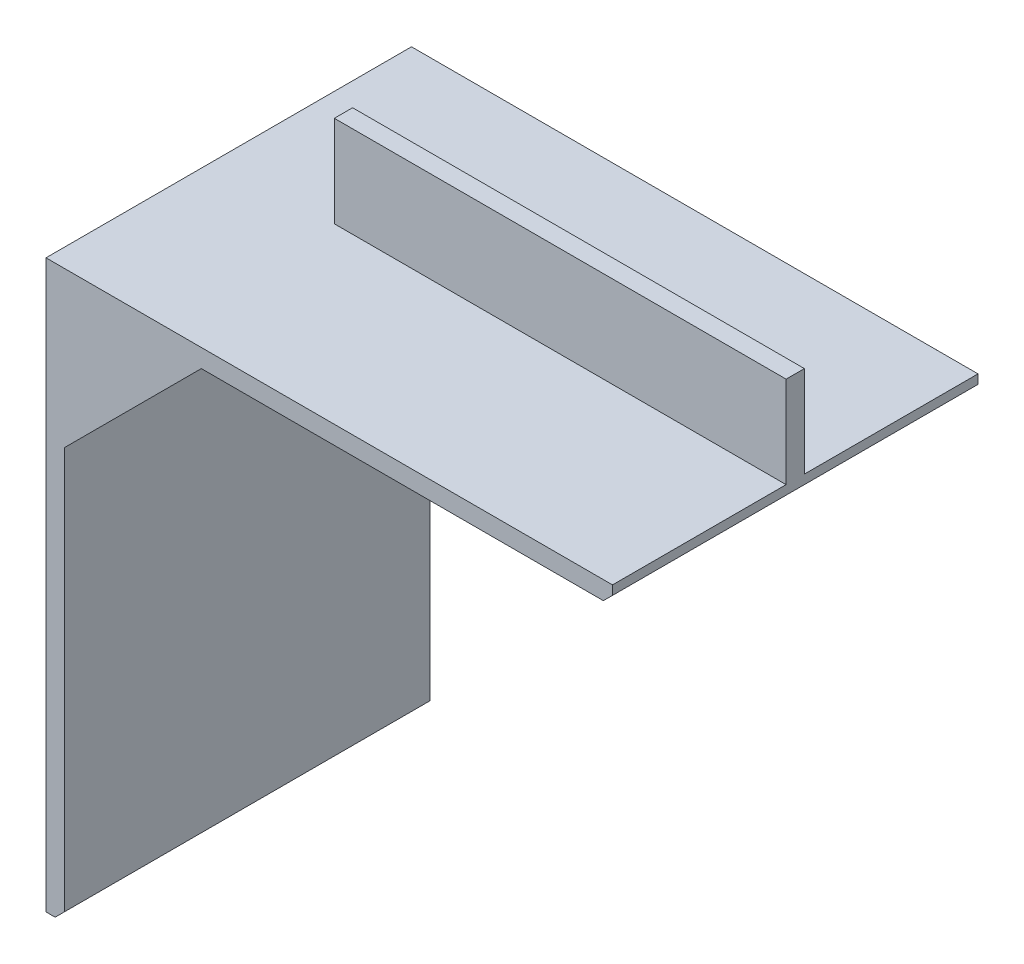
ISO-10303-21;
HEADER;
FILE_DESCRIPTION(('STEP AP214'),'2;1');
FILE_NAME('part.step','',(''),(''),'','','');
FILE_SCHEMA(('AUTOMOTIVE_DESIGN { 1 0 10303 214 1 1 1 1 }'));
ENDSEC;
DATA;
#1=APPLICATION_CONTEXT('core data for automotive mechanical design processes');
#2=APPLICATION_PROTOCOL_DEFINITION('international standard','automotive_design',2000,#1);
#3=PRODUCT_CONTEXT('',#1,'mechanical');
#4=PRODUCT('Part','Part','',(#3));
#5=PRODUCT_RELATED_PRODUCT_CATEGORY('part','',(#4));
#6=PRODUCT_DEFINITION_FORMATION('','',#4);
#7=PRODUCT_DEFINITION_CONTEXT('part definition',#1,'design');
#8=PRODUCT_DEFINITION('design','',#6,#7);
#9=PRODUCT_DEFINITION_SHAPE('','',#8);
#10=(LENGTH_UNIT() NAMED_UNIT(*) SI_UNIT(.MILLI.,.METRE.));
#11=(NAMED_UNIT(*) PLANE_ANGLE_UNIT() SI_UNIT($,.RADIAN.));
#12=(NAMED_UNIT(*) SI_UNIT($,.STERADIAN.) SOLID_ANGLE_UNIT());
#13=UNCERTAINTY_MEASURE_WITH_UNIT(LENGTH_MEASURE(1.E-05),#10,'distance_accuracy_value','');
#14=(GEOMETRIC_REPRESENTATION_CONTEXT(3) GLOBAL_UNCERTAINTY_ASSIGNED_CONTEXT((#13)) GLOBAL_UNIT_ASSIGNED_CONTEXT((#10,
#11,#12)) REPRESENTATION_CONTEXT('',''));
#15=CARTESIAN_POINT('',(0.,0.,0.));
#16=DIRECTION('',(0.,0.,1.));
#17=DIRECTION('',(1.,0.,0.));
#18=AXIS2_PLACEMENT_3D('',#15,#16,#17);
#19=CARTESIAN_POINT('',(0.,-60.,40.));
#20=DIRECTION('',(-1.,0.,0.));
#21=DIRECTION('',(0.,0.,1.));
#22=AXIS2_PLACEMENT_3D('',#19,#20,#21);
#23=PLANE('',#22);
#24=DIRECTION('',(0.,1.,0.));
#25=VECTOR('',#24,1.);
#26=CARTESIAN_POINT('',(0.,-60.,40.));
#27=LINE('',#26,#25);
#28=CARTESIAN_POINT('',(0.,-59.,40.));
#29=VERTEX_POINT('',#28);
#30=CARTESIAN_POINT('',(0.,-15.,40.));
#31=VERTEX_POINT('',#30);
#32=EDGE_CURVE('E265',#29,#31,#27,.T.);
#33=ORIENTED_EDGE('',*,*,#32,.F.);
#34=DIRECTION('',(0.,0.,-1.));
#35=VECTOR('',#34,1.);
#36=CARTESIAN_POINT('',(0.,-59.,40.));
#37=LINE('',#36,#35);
#38=CARTESIAN_POINT('',(0.,-59.,0.));
#39=VERTEX_POINT('',#38);
#40=EDGE_CURVE('E44',#29,#39,#37,.T.);
#41=ORIENTED_EDGE('',*,*,#40,.T.);
#42=DIRECTION('',(0.,1.,0.));
#43=VECTOR('',#42,1.);
#44=CARTESIAN_POINT('',(0.,-60.,0.));
#45=LINE('',#44,#43);
#46=CARTESIAN_POINT('',(0.,-15.,0.));
#47=VERTEX_POINT('',#46);
#48=EDGE_CURVE('E262',#39,#47,#45,.T.);
#49=ORIENTED_EDGE('',*,*,#48,.T.);
#50=DIRECTION('',(0.,0.,1.));
#51=VECTOR('',#50,1.);
#52=CARTESIAN_POINT('',(0.,-15.,0.));
#53=LINE('',#52,#51);
#54=CARTESIAN_POINT('',(0.,-15.,3.));
#55=VERTEX_POINT('',#54);
#56=EDGE_CURVE('E243',#47,#55,#53,.T.);
#57=ORIENTED_EDGE('',*,*,#56,.T.);
#58=DIRECTION('',(0.,-1.,0.));
#59=VECTOR('',#58,1.);
#60=CARTESIAN_POINT('',(0.,0.,3.));
#61=LINE('',#60,#59);
#62=CARTESIAN_POINT('',(0.,0.,3.));
#63=VERTEX_POINT('',#62);
#64=EDGE_CURVE('E235',#63,#55,#61,.T.);
#65=ORIENTED_EDGE('',*,*,#64,.F.);
#66=DIRECTION('',(0.,0.,-1.));
#67=VECTOR('',#66,1.);
#68=CARTESIAN_POINT('',(0.,0.,40.));
#69=LINE('',#68,#67);
#70=CARTESIAN_POINT('',(0.,0.,37.));
#71=VERTEX_POINT('',#70);
#72=EDGE_CURVE('E305',#71,#63,#69,.T.);
#73=ORIENTED_EDGE('',*,*,#72,.F.);
#74=DIRECTION('',(0.,-1.,0.));
#75=VECTOR('',#74,1.);
#76=CARTESIAN_POINT('',(0.,0.,37.));
#77=LINE('',#76,#75);
#78=CARTESIAN_POINT('',(0.,-15.,37.));
#79=VERTEX_POINT('',#78);
#80=EDGE_CURVE('E254',#71,#79,#77,.T.);
#81=ORIENTED_EDGE('',*,*,#80,.T.);
#82=DIRECTION('',(0.,0.,1.));
#83=VECTOR('',#82,1.);
#84=CARTESIAN_POINT('',(0.,-15.,37.));
#85=LINE('',#84,#83);
#86=EDGE_CURVE('E259',#79,#31,#85,.T.);
#87=ORIENTED_EDGE('',*,*,#86,.T.);
#88=EDGE_LOOP('',(#33,#41,#49,#57,#65,#73,#81,#87));
#89=FACE_BOUND('',#88,.T.);
#90=ADVANCED_FACE('F35',(#89),#23,.F.);
#91=CARTESIAN_POINT('',(0.,0.,40.));
#92=DIRECTION('',(0.,1.,0.));
#93=DIRECTION('',(0.,0.,1.));
#94=AXIS2_PLACEMENT_3D('',#91,#92,#93);
#95=PLANE('',#94);
#96=DIRECTION('',(1.,0.,0.));
#97=VECTOR('',#96,1.);
#98=CARTESIAN_POINT('',(0.,0.,0.));
#99=LINE('',#98,#97);
#100=CARTESIAN_POINT('',(15.,0.,0.));
#101=VERTEX_POINT('',#100);
#102=CARTESIAN_POINT('',(59.,0.,0.));
#103=VERTEX_POINT('',#102);
#104=EDGE_CURVE('E282',#101,#103,#99,.T.);
#105=ORIENTED_EDGE('',*,*,#104,.T.);
#106=DIRECTION('',(0.,0.,1.));
#107=VECTOR('',#106,1.);
#108=CARTESIAN_POINT('',(59.,0.,40.));
#109=LINE('',#108,#107);
#110=CARTESIAN_POINT('',(59.,0.,40.));
#111=VERTEX_POINT('',#110);
#112=EDGE_CURVE('E315',#103,#111,#109,.T.);
#113=ORIENTED_EDGE('',*,*,#112,.T.);
#114=DIRECTION('',(1.,0.,0.));
#115=VECTOR('',#114,1.);
#116=CARTESIAN_POINT('',(0.,0.,40.));
#117=LINE('',#116,#115);
#118=CARTESIAN_POINT('',(15.,0.,40.));
#119=VERTEX_POINT('',#118);
#120=EDGE_CURVE('E267',#119,#111,#117,.T.);
#121=ORIENTED_EDGE('',*,*,#120,.F.);
#122=DIRECTION('',(0.,0.,1.));
#123=VECTOR('',#122,1.);
#124=CARTESIAN_POINT('',(15.,0.,37.));
#125=LINE('',#124,#123);
#126=CARTESIAN_POINT('',(15.,0.,37.));
#127=VERTEX_POINT('',#126);
#128=EDGE_CURVE('E257',#127,#119,#125,.T.);
#129=ORIENTED_EDGE('',*,*,#128,.F.);
#130=DIRECTION('',(-1.,0.,0.));
#131=VECTOR('',#130,1.);
#132=CARTESIAN_POINT('',(15.,0.,37.));
#133=LINE('',#132,#131);
#134=EDGE_CURVE('E251',#127,#71,#133,.T.);
#135=ORIENTED_EDGE('',*,*,#134,.T.);
#136=ORIENTED_EDGE('',*,*,#72,.T.);
#137=DIRECTION('',(-1.,0.,0.));
#138=VECTOR('',#137,1.);
#139=CARTESIAN_POINT('',(15.,0.,3.));
#140=LINE('',#139,#138);
#141=CARTESIAN_POINT('',(15.,0.,3.));
#142=VERTEX_POINT('',#141);
#143=EDGE_CURVE('E238',#142,#63,#140,.T.);
#144=ORIENTED_EDGE('',*,*,#143,.F.);
#145=DIRECTION('',(0.,0.,1.));
#146=VECTOR('',#145,1.);
#147=CARTESIAN_POINT('',(15.,0.,0.));
#148=LINE('',#147,#146);
#149=EDGE_CURVE('E234',#101,#142,#148,.T.);
#150=ORIENTED_EDGE('',*,*,#149,.F.);
#151=EDGE_LOOP('',(#105,#113,#121,#129,#135,#136,#144,#150));
#152=FACE_BOUND('',#151,.T.);
#153=ADVANCED_FACE('F340',(#152),#95,.F.);
#154=CARTESIAN_POINT('',(60.,0.,40.));
#155=DIRECTION('',(-1.,0.,0.));
#156=DIRECTION('',(0.,0.,1.));
#157=AXIS2_PLACEMENT_3D('',#154,#155,#156);
#158=PLANE('',#157);
#159=DIRECTION('',(0.,1.,0.));
#160=VECTOR('',#159,1.);
#161=CARTESIAN_POINT('',(60.,0.,40.));
#162=LINE('',#161,#160);
#163=CARTESIAN_POINT('',(60.,0.999999999999987,40.));
#164=VERTEX_POINT('',#163);
#165=CARTESIAN_POINT('',(60.,2.,40.));
#166=VERTEX_POINT('',#165);
#167=EDGE_CURVE('E271',#164,#166,#162,.T.);
#168=ORIENTED_EDGE('',*,*,#167,.F.);
#169=DIRECTION('',(0.,0.,-1.));
#170=VECTOR('',#169,1.);
#171=CARTESIAN_POINT('',(60.,0.999999999999987,40.));
#172=LINE('',#171,#170);
#173=CARTESIAN_POINT('',(60.,0.999999999999987,0.));
#174=VERTEX_POINT('',#173);
#175=EDGE_CURVE('E308',#164,#174,#172,.T.);
#176=ORIENTED_EDGE('',*,*,#175,.T.);
#177=DIRECTION('',(0.,1.,0.));
#178=VECTOR('',#177,1.);
#179=CARTESIAN_POINT('',(60.,0.,0.));
#180=LINE('',#179,#178);
#181=CARTESIAN_POINT('',(60.,2.,0.));
#182=VERTEX_POINT('',#181);
#183=EDGE_CURVE('E285',#174,#182,#180,.T.);
#184=ORIENTED_EDGE('',*,*,#183,.T.);
#185=DIRECTION('',(0.,0.,-1.));
#186=VECTOR('',#185,1.);
#187=CARTESIAN_POINT('',(60.,2.,40.));
#188=LINE('',#187,#186);
#189=CARTESIAN_POINT('',(60.,2.00000000000003,19.));
#190=VERTEX_POINT('',#189);
#191=EDGE_CURVE('E301',#190,#182,#188,.T.);
#192=ORIENTED_EDGE('',*,*,#191,.F.);
#193=DIRECTION('',(0.,1.,0.));
#194=VECTOR('',#193,1.);
#195=CARTESIAN_POINT('',(60.,2.00000000000003,19.));
#196=LINE('',#195,#194);
#197=CARTESIAN_POINT('',(60.,12.,19.));
#198=VERTEX_POINT('',#197);
#199=EDGE_CURVE('E192',#190,#198,#196,.T.);
#200=ORIENTED_EDGE('',*,*,#199,.T.);
#201=DIRECTION('',(0.,0.,-1.));
#202=VECTOR('',#201,1.);
#203=CARTESIAN_POINT('',(60.,12.,21.));
#204=LINE('',#203,#202);
#205=CARTESIAN_POINT('',(60.,12.,21.));
#206=VERTEX_POINT('',#205);
#207=EDGE_CURVE('E202',#206,#198,#204,.T.);
#208=ORIENTED_EDGE('',*,*,#207,.F.);
#209=DIRECTION('',(0.,1.,0.));
#210=VECTOR('',#209,1.);
#211=CARTESIAN_POINT('',(60.,2.00000000000003,21.));
#212=LINE('',#211,#210);
#213=CARTESIAN_POINT('',(60.,2.00000000000003,21.));
#214=VERTEX_POINT('',#213);
#215=EDGE_CURVE('E188',#214,#206,#212,.T.);
#216=ORIENTED_EDGE('',*,*,#215,.F.);
#217=EDGE_CURVE('E302',#166,#214,#188,.T.);
#218=ORIENTED_EDGE('',*,*,#217,.F.);
#219=EDGE_LOOP('',(#168,#176,#184,#192,#200,#208,#216,#218));
#220=FACE_BOUND('',#219,.T.);
#221=ADVANCED_FACE('F359',(#220),#158,.F.);
#222=CARTESIAN_POINT('',(60.,2.,40.));
#223=DIRECTION('',(0.,-1.,0.));
#224=DIRECTION('',(1.,0.,0.));
#225=AXIS2_PLACEMENT_3D('',#222,#223,#224);
#226=PLANE('',#225);
#227=DIRECTION('',(0.,0.,-1.));
#228=VECTOR('',#227,1.);
#229=CARTESIAN_POINT('',(10.5548745059434,2.00000000000001,21.));
#230=LINE('',#229,#228);
#231=CARTESIAN_POINT('',(10.5548745059434,2.00000000000001,21.));
#232=VERTEX_POINT('',#231);
#233=CARTESIAN_POINT('',(10.5548745059434,2.00000000000001,19.));
#234=VERTEX_POINT('',#233);
#235=EDGE_CURVE('E179',#232,#234,#230,.T.);
#236=ORIENTED_EDGE('',*,*,#235,.T.);
#237=DIRECTION('',(1.,0.,0.));
#238=VECTOR('',#237,1.);
#239=CARTESIAN_POINT('',(10.5548745059434,2.00000000000001,19.));
#240=LINE('',#239,#238);
#241=EDGE_CURVE('E51',#234,#190,#240,.T.);
#242=ORIENTED_EDGE('',*,*,#241,.T.);
#243=ORIENTED_EDGE('',*,*,#191,.T.);
#244=DIRECTION('',(-1.,0.,0.));
#245=VECTOR('',#244,1.);
#246=CARTESIAN_POINT('',(60.,2.,0.));
#247=LINE('',#246,#245);
#248=CARTESIAN_POINT('',(-2.,2.,0.));
#249=VERTEX_POINT('',#248);
#250=EDGE_CURVE('E288',#182,#249,#247,.T.);
#251=ORIENTED_EDGE('',*,*,#250,.T.);
#252=DIRECTION('',(0.,0.,-1.));
#253=VECTOR('',#252,1.);
#254=CARTESIAN_POINT('',(-2.,2.,40.));
#255=LINE('',#254,#253);
#256=CARTESIAN_POINT('',(-2.,2.,40.));
#257=VERTEX_POINT('',#256);
#258=EDGE_CURVE('E298',#257,#249,#255,.T.);
#259=ORIENTED_EDGE('',*,*,#258,.F.);
#260=DIRECTION('',(-1.,0.,0.));
#261=VECTOR('',#260,1.);
#262=CARTESIAN_POINT('',(60.,2.,40.));
#263=LINE('',#262,#261);
#264=EDGE_CURVE('E273',#166,#257,#263,.T.);
#265=ORIENTED_EDGE('',*,*,#264,.F.);
#266=ORIENTED_EDGE('',*,*,#217,.T.);
#267=DIRECTION('',(1.,0.,0.));
#268=VECTOR('',#267,1.);
#269=CARTESIAN_POINT('',(10.5548745059434,2.00000000000001,21.));
#270=LINE('',#269,#268);
#271=EDGE_CURVE('E182',#232,#214,#270,.T.);
#272=ORIENTED_EDGE('',*,*,#271,.F.);
#273=EDGE_LOOP('',(#236,#242,#243,#251,#259,#265,#266,#272));
#274=FACE_BOUND('',#273,.T.);
#275=ADVANCED_FACE('F369',(#274),#226,.F.);
#276=CARTESIAN_POINT('',(-2.,2.,40.));
#277=DIRECTION('',(1.,0.,0.));
#278=DIRECTION('',(0.,1.,0.));
#279=AXIS2_PLACEMENT_3D('',#276,#277,#278);
#280=PLANE('',#279);
#281=DIRECTION('',(0.,0.,-1.));
#282=VECTOR('',#281,1.);
#283=CARTESIAN_POINT('',(-2.,-60.,40.));
#284=LINE('',#283,#282);
#285=CARTESIAN_POINT('',(-2.,-60.,19.));
#286=VERTEX_POINT('',#285);
#287=CARTESIAN_POINT('',(-2.,-60.,0.));
#288=VERTEX_POINT('',#287);
#289=EDGE_CURVE('E280',#286,#288,#284,.T.);
#290=ORIENTED_EDGE('',*,*,#289,.F.);
#291=DIRECTION('',(0.,1.,0.));
#292=VECTOR('',#291,1.);
#293=CARTESIAN_POINT('',(-2.,-10.5548745059434,19.));
#294=LINE('',#293,#292);
#295=CARTESIAN_POINT('',(-2.,-10.5548745059434,19.));
#296=VERTEX_POINT('',#295);
#297=EDGE_CURVE('E59',#286,#296,#294,.T.);
#298=ORIENTED_EDGE('',*,*,#297,.T.);
#299=DIRECTION('',(0.,0.,-1.));
#300=VECTOR('',#299,1.);
#301=CARTESIAN_POINT('',(-2.,-10.5548745059434,21.));
#302=LINE('',#301,#300);
#303=CARTESIAN_POINT('',(-2.,-10.5548745059434,21.));
#304=VERTEX_POINT('',#303);
#305=EDGE_CURVE('E216',#304,#296,#302,.T.);
#306=ORIENTED_EDGE('',*,*,#305,.F.);
#307=DIRECTION('',(0.,1.,0.));
#308=VECTOR('',#307,1.);
#309=CARTESIAN_POINT('',(-2.,-10.5548745059434,21.));
#310=LINE('',#309,#308);
#311=CARTESIAN_POINT('',(-2.,-60.,21.));
#312=VERTEX_POINT('',#311);
#313=EDGE_CURVE('E214',#312,#304,#310,.T.);
#314=ORIENTED_EDGE('',*,*,#313,.F.);
#315=CARTESIAN_POINT('',(-2.,-60.,40.));
#316=VERTEX_POINT('',#315);
#317=EDGE_CURVE('E295',#316,#312,#284,.T.);
#318=ORIENTED_EDGE('',*,*,#317,.F.);
#319=DIRECTION('',(0.,-1.,0.));
#320=VECTOR('',#319,1.);
#321=CARTESIAN_POINT('',(-2.,2.,40.));
#322=LINE('',#321,#320);
#323=EDGE_CURVE('E275',#257,#316,#322,.T.);
#324=ORIENTED_EDGE('',*,*,#323,.F.);
#325=ORIENTED_EDGE('',*,*,#258,.T.);
#326=DIRECTION('',(0.,-1.,0.));
#327=VECTOR('',#326,1.);
#328=CARTESIAN_POINT('',(-2.,2.,0.));
#329=LINE('',#328,#327);
#330=EDGE_CURVE('E290',#249,#288,#329,.T.);
#331=ORIENTED_EDGE('',*,*,#330,.T.);
#332=EDGE_LOOP('',(#290,#298,#306,#314,#318,#324,#325,#331));
#333=FACE_BOUND('',#332,.T.);
#334=ADVANCED_FACE('F373',(#333),#280,.F.);
#335=CARTESIAN_POINT('',(-2.,-60.,40.));
#336=DIRECTION('',(0.,1.,0.));
#337=DIRECTION('',(0.,0.,1.));
#338=AXIS2_PLACEMENT_3D('',#335,#336,#337);
#339=PLANE('',#338);
#340=DIRECTION('',(1.,0.,0.));
#341=VECTOR('',#340,1.);
#342=CARTESIAN_POINT('',(-2.,-60.,0.));
#343=LINE('',#342,#341);
#344=CARTESIAN_POINT('',(-1.00000000000001,-60.,0.));
#345=VERTEX_POINT('',#344);
#346=EDGE_CURVE('E268',#288,#345,#343,.T.);
#347=ORIENTED_EDGE('',*,*,#346,.T.);
#348=DIRECTION('',(0.,0.,1.));
#349=VECTOR('',#348,1.);
#350=CARTESIAN_POINT('',(-1.00000000000001,-60.,40.));
#351=LINE('',#350,#349);
#352=CARTESIAN_POINT('',(-1.00000000000001,-60.,40.));
#353=VERTEX_POINT('',#352);
#354=EDGE_CURVE('E11',#345,#353,#351,.T.);
#355=ORIENTED_EDGE('',*,*,#354,.T.);
#356=DIRECTION('',(1.,0.,0.));
#357=VECTOR('',#356,1.);
#358=CARTESIAN_POINT('',(-2.,-60.,40.));
#359=LINE('',#358,#357);
#360=EDGE_CURVE('E277',#316,#353,#359,.T.);
#361=ORIENTED_EDGE('',*,*,#360,.F.);
#362=ORIENTED_EDGE('',*,*,#317,.T.);
#363=DIRECTION('',(1.,0.,0.));
#364=VECTOR('',#363,1.);
#365=CARTESIAN_POINT('',(-2.,-60.,21.));
#366=LINE('',#365,#364);
#367=CARTESIAN_POINT('',(-12.,-60.,21.));
#368=VERTEX_POINT('',#367);
#369=EDGE_CURVE('E211',#368,#312,#366,.T.);
#370=ORIENTED_EDGE('',*,*,#369,.F.);
#371=DIRECTION('',(0.,0.,-1.));
#372=VECTOR('',#371,1.);
#373=CARTESIAN_POINT('',(-12.,-60.,21.));
#374=LINE('',#373,#372);
#375=CARTESIAN_POINT('',(-12.,-60.,19.));
#376=VERTEX_POINT('',#375);
#377=EDGE_CURVE('E224',#368,#376,#374,.T.);
#378=ORIENTED_EDGE('',*,*,#377,.T.);
#379=DIRECTION('',(1.,0.,0.));
#380=VECTOR('',#379,1.);
#381=CARTESIAN_POINT('',(-2.,-60.,19.));
#382=LINE('',#381,#380);
#383=EDGE_CURVE('E219',#376,#286,#382,.T.);
#384=ORIENTED_EDGE('',*,*,#383,.T.);
#385=ORIENTED_EDGE('',*,*,#289,.T.);
#386=EDGE_LOOP('',(#347,#355,#361,#362,#370,#378,#384,#385));
#387=FACE_BOUND('',#386,.T.);
#388=ADVANCED_FACE('F377',(#387),#339,.F.);
#389=CARTESIAN_POINT('',(0.,0.,40.));
#390=DIRECTION('',(0.,0.,-1.));
#391=DIRECTION('',(-1.,0.,0.));
#392=AXIS2_PLACEMENT_3D('',#389,#390,#391);
#393=PLANE('',#392);
#394=ORIENTED_EDGE('',*,*,#120,.T.);
#395=DIRECTION('',(-0.707106781186552,-0.707106781186543,0.));
#396=VECTOR('',#395,1.);
#397=CARTESIAN_POINT('',(60.,0.999999999999987,40.));
#398=LINE('',#397,#396);
#399=EDGE_CURVE('E319',#111,#164,#398,.F.);
#400=ORIENTED_EDGE('',*,*,#399,.T.);
#401=ORIENTED_EDGE('',*,*,#167,.T.);
#402=ORIENTED_EDGE('',*,*,#264,.T.);
#403=ORIENTED_EDGE('',*,*,#323,.T.);
#404=ORIENTED_EDGE('',*,*,#360,.T.);
#405=DIRECTION('',(-0.707106781186552,-0.707106781186543,0.));
#406=VECTOR('',#405,1.);
#407=CARTESIAN_POINT('',(0.,-59.,40.));
#408=LINE('',#407,#406);
#409=EDGE_CURVE('E317',#353,#29,#408,.F.);
#410=ORIENTED_EDGE('',*,*,#409,.T.);
#411=ORIENTED_EDGE('',*,*,#32,.T.);
#412=DIRECTION('',(0.707106781186547,0.707106781186548,0.));
#413=VECTOR('',#412,1.);
#414=CARTESIAN_POINT('',(0.,-15.,40.));
#415=LINE('',#414,#413);
#416=EDGE_CURVE('E245',#31,#119,#415,.T.);
#417=ORIENTED_EDGE('',*,*,#416,.T.);
#418=EDGE_LOOP('',(#394,#400,#401,#402,#403,#404,#410,#411,#417));
#419=FACE_BOUND('',#418,.T.);
#420=ADVANCED_FACE('F380',(#419),#393,.F.);
#421=CARTESIAN_POINT('',(0.,0.,0.));
#422=DIRECTION('',(0.,0.,-1.));
#423=DIRECTION('',(-1.,0.,0.));
#424=AXIS2_PLACEMENT_3D('',#421,#422,#423);
#425=PLANE('',#424);
#426=ORIENTED_EDGE('',*,*,#183,.F.);
#427=DIRECTION('',(0.707106781186552,0.707106781186543,0.));
#428=VECTOR('',#427,1.);
#429=CARTESIAN_POINT('',(29.4999999999996,-29.5,0.));
#430=LINE('',#429,#428);
#431=EDGE_CURVE('E313',#174,#103,#430,.F.);
#432=ORIENTED_EDGE('',*,*,#431,.T.);
#433=ORIENTED_EDGE('',*,*,#104,.F.);
#434=DIRECTION('',(0.707106781186547,0.707106781186548,0.));
#435=VECTOR('',#434,1.);
#436=CARTESIAN_POINT('',(0.,-15.,0.));
#437=LINE('',#436,#435);
#438=EDGE_CURVE('E231',#47,#101,#437,.T.);
#439=ORIENTED_EDGE('',*,*,#438,.F.);
#440=ORIENTED_EDGE('',*,*,#48,.F.);
#441=DIRECTION('',(0.707106781186552,0.707106781186543,0.));
#442=VECTOR('',#441,1.);
#443=CARTESIAN_POINT('',(29.5,-29.5000000000004,0.));
#444=LINE('',#443,#442);
#445=EDGE_CURVE('E311',#39,#345,#444,.F.);
#446=ORIENTED_EDGE('',*,*,#445,.T.);
#447=ORIENTED_EDGE('',*,*,#346,.F.);
#448=ORIENTED_EDGE('',*,*,#330,.F.);
#449=ORIENTED_EDGE('',*,*,#250,.F.);
#450=EDGE_LOOP('',(#426,#432,#433,#439,#440,#446,#447,#448,#449));
#451=FACE_BOUND('',#450,.T.);
#452=ADVANCED_FACE('F331',(#451),#425,.T.);
#453=CARTESIAN_POINT('',(0.,-15.,37.));
#454=DIRECTION('',(0.707106781186548,-0.707106781186547,0.));
#455=DIRECTION('',(0.707106781186547,0.707106781186548,0.));
#456=AXIS2_PLACEMENT_3D('',#453,#454,#455);
#457=PLANE('',#456);
#458=ORIENTED_EDGE('',*,*,#416,.F.);
#459=ORIENTED_EDGE('',*,*,#86,.F.);
#460=DIRECTION('',(0.707106781186547,0.707106781186548,0.));
#461=VECTOR('',#460,1.);
#462=CARTESIAN_POINT('',(0.,-15.,37.));
#463=LINE('',#462,#461);
#464=EDGE_CURVE('E248',#79,#127,#463,.T.);
#465=ORIENTED_EDGE('',*,*,#464,.T.);
#466=ORIENTED_EDGE('',*,*,#128,.T.);
#467=EDGE_LOOP('',(#458,#459,#465,#466));
#468=FACE_BOUND('',#467,.T.);
#469=ADVANCED_FACE('F384',(#468),#457,.T.);
#470=CARTESIAN_POINT('',(0.,0.,37.));
#471=DIRECTION('',(0.,0.,1.));
#472=DIRECTION('',(1.,0.,0.));
#473=AXIS2_PLACEMENT_3D('',#470,#471,#472);
#474=PLANE('',#473);
#475=ORIENTED_EDGE('',*,*,#464,.F.);
#476=ORIENTED_EDGE('',*,*,#80,.F.);
#477=ORIENTED_EDGE('',*,*,#134,.F.);
#478=EDGE_LOOP('',(#475,#476,#477));
#479=FACE_BOUND('',#478,.T.);
#480=ADVANCED_FACE('F351',(#479),#474,.F.);
#481=CARTESIAN_POINT('',(0.,-15.,0.));
#482=DIRECTION('',(0.707106781186548,-0.707106781186547,0.));
#483=DIRECTION('',(0.707106781186547,0.707106781186548,0.));
#484=AXIS2_PLACEMENT_3D('',#481,#482,#483);
#485=PLANE('',#484);
#486=DIRECTION('',(0.707106781186547,0.707106781186548,0.));
#487=VECTOR('',#486,1.);
#488=CARTESIAN_POINT('',(0.,-15.,3.));
#489=LINE('',#488,#487);
#490=EDGE_CURVE('E230',#55,#142,#489,.T.);
#491=ORIENTED_EDGE('',*,*,#490,.F.);
#492=ORIENTED_EDGE('',*,*,#56,.F.);
#493=ORIENTED_EDGE('',*,*,#438,.T.);
#494=ORIENTED_EDGE('',*,*,#149,.T.);
#495=EDGE_LOOP('',(#491,#492,#493,#494));
#496=FACE_BOUND('',#495,.T.);
#497=ADVANCED_FACE('F336',(#496),#485,.T.);
#498=CARTESIAN_POINT('',(0.,0.,3.));
#499=DIRECTION('',(0.,0.,1.));
#500=DIRECTION('',(1.,0.,0.));
#501=AXIS2_PLACEMENT_3D('',#498,#499,#500);
#502=PLANE('',#501);
#503=ORIENTED_EDGE('',*,*,#490,.T.);
#504=ORIENTED_EDGE('',*,*,#143,.T.);
#505=ORIENTED_EDGE('',*,*,#64,.T.);
#506=EDGE_LOOP('',(#503,#504,#505));
#507=FACE_BOUND('',#506,.T.);
#508=ADVANCED_FACE('F342',(#507),#502,.T.);
#509=CARTESIAN_POINT('',(60.,0.999999999999987,40.));
#510=DIRECTION('',(-0.707106781186543,0.707106781186552,0.));
#511=DIRECTION('',(0.,0.,-1.));
#512=AXIS2_PLACEMENT_3D('',#509,#510,#511);
#513=PLANE('',#512);
#514=ORIENTED_EDGE('',*,*,#399,.F.);
#515=ORIENTED_EDGE('',*,*,#112,.F.);
#516=ORIENTED_EDGE('',*,*,#431,.F.);
#517=ORIENTED_EDGE('',*,*,#175,.F.);
#518=EDGE_LOOP('',(#514,#515,#516,#517));
#519=FACE_BOUND('',#518,.T.);
#520=ADVANCED_FACE('F344',(#519),#513,.F.);
#521=CARTESIAN_POINT('',(0.,-59.,40.));
#522=DIRECTION('',(-0.707106781186542,0.707106781186552,0.));
#523=DIRECTION('',(0.,0.,-1.));
#524=AXIS2_PLACEMENT_3D('',#521,#522,#523);
#525=PLANE('',#524);
#526=ORIENTED_EDGE('',*,*,#409,.F.);
#527=ORIENTED_EDGE('',*,*,#354,.F.);
#528=ORIENTED_EDGE('',*,*,#445,.F.);
#529=ORIENTED_EDGE('',*,*,#40,.F.);
#530=EDGE_LOOP('',(#526,#527,#528,#529));
#531=FACE_BOUND('',#530,.T.);
#532=ADVANCED_FACE('F38',(#531),#525,.F.);
#533=CARTESIAN_POINT('',(-12.,-10.5548745059434,21.));
#534=DIRECTION('',(0.,-1.,0.));
#535=DIRECTION('',(0.,0.,-1.));
#536=AXIS2_PLACEMENT_3D('',#533,#534,#535);
#537=PLANE('',#536);
#538=DIRECTION('',(-1.,0.,0.));
#539=VECTOR('',#538,1.);
#540=CARTESIAN_POINT('',(-12.,-10.5548745059434,19.));
#541=LINE('',#540,#539);
#542=CARTESIAN_POINT('',(-12.,-10.5548745059434,19.));
#543=VERTEX_POINT('',#542);
#544=EDGE_CURVE('E197',#296,#543,#541,.T.);
#545=ORIENTED_EDGE('',*,*,#544,.T.);
#546=DIRECTION('',(0.,0.,-1.));
#547=VECTOR('',#546,1.);
#548=CARTESIAN_POINT('',(-12.,-10.5548745059434,21.));
#549=LINE('',#548,#547);
#550=CARTESIAN_POINT('',(-12.,-10.5548745059434,21.));
#551=VERTEX_POINT('',#550);
#552=EDGE_CURVE('E227',#551,#543,#549,.T.);
#553=ORIENTED_EDGE('',*,*,#552,.F.);
#554=DIRECTION('',(-1.,0.,0.));
#555=VECTOR('',#554,1.);
#556=CARTESIAN_POINT('',(-12.,-10.5548745059434,21.));
#557=LINE('',#556,#555);
#558=EDGE_CURVE('E206',#304,#551,#557,.T.);
#559=ORIENTED_EDGE('',*,*,#558,.F.);
#560=ORIENTED_EDGE('',*,*,#305,.T.);
#561=EDGE_LOOP('',(#545,#553,#559,#560));
#562=FACE_BOUND('',#561,.T.);
#563=ADVANCED_FACE('F441',(#562),#537,.F.);
#564=CARTESIAN_POINT('',(-12.,-60.,21.));
#565=DIRECTION('',(1.,0.,0.));
#566=DIRECTION('',(0.,0.,-1.));
#567=AXIS2_PLACEMENT_3D('',#564,#565,#566);
#568=PLANE('',#567);
#569=DIRECTION('',(0.,-1.,0.));
#570=VECTOR('',#569,1.);
#571=CARTESIAN_POINT('',(-12.,-60.,19.));
#572=LINE('',#571,#570);
#573=EDGE_CURVE('E200',#543,#376,#572,.T.);
#574=ORIENTED_EDGE('',*,*,#573,.T.);
#575=ORIENTED_EDGE('',*,*,#377,.F.);
#576=DIRECTION('',(0.,-1.,0.));
#577=VECTOR('',#576,1.);
#578=CARTESIAN_POINT('',(-12.,-60.,21.));
#579=LINE('',#578,#577);
#580=EDGE_CURVE('E209',#551,#368,#579,.T.);
#581=ORIENTED_EDGE('',*,*,#580,.F.);
#582=ORIENTED_EDGE('',*,*,#552,.T.);
#583=EDGE_LOOP('',(#574,#575,#581,#582));
#584=FACE_BOUND('',#583,.T.);
#585=ADVANCED_FACE('F435',(#584),#568,.F.);
#586=CARTESIAN_POINT('',(0.,0.,21.));
#587=DIRECTION('',(0.,0.,-1.));
#588=DIRECTION('',(-1.,0.,0.));
#589=AXIS2_PLACEMENT_3D('',#586,#587,#588);
#590=PLANE('',#589);
#591=ORIENTED_EDGE('',*,*,#558,.T.);
#592=ORIENTED_EDGE('',*,*,#580,.T.);
#593=ORIENTED_EDGE('',*,*,#369,.T.);
#594=ORIENTED_EDGE('',*,*,#313,.T.);
#595=EDGE_LOOP('',(#591,#592,#593,#594));
#596=FACE_BOUND('',#595,.T.);
#597=ADVANCED_FACE('F432',(#596),#590,.F.);
#598=CARTESIAN_POINT('',(0.,0.,19.));
#599=DIRECTION('',(0.,0.,-1.));
#600=DIRECTION('',(-1.,0.,0.));
#601=AXIS2_PLACEMENT_3D('',#598,#599,#600);
#602=PLANE('',#601);
#603=ORIENTED_EDGE('',*,*,#544,.F.);
#604=ORIENTED_EDGE('',*,*,#297,.F.);
#605=ORIENTED_EDGE('',*,*,#383,.F.);
#606=ORIENTED_EDGE('',*,*,#573,.F.);
#607=EDGE_LOOP('',(#603,#604,#605,#606));
#608=FACE_BOUND('',#607,.T.);
#609=ADVANCED_FACE('F431',(#608),#602,.T.);
#610=CARTESIAN_POINT('',(60.,12.,21.));
#611=DIRECTION('',(0.,-1.,0.));
#612=DIRECTION('',(1.,0.,0.));
#613=AXIS2_PLACEMENT_3D('',#610,#611,#612);
#614=PLANE('',#613);
#615=DIRECTION('',(-1.,0.,0.));
#616=VECTOR('',#615,1.);
#617=CARTESIAN_POINT('',(60.,12.,19.));
#618=LINE('',#617,#616);
#619=CARTESIAN_POINT('',(10.5548745059434,12.,19.));
#620=VERTEX_POINT('',#619);
#621=EDGE_CURVE('E196',#198,#620,#618,.T.);
#622=ORIENTED_EDGE('',*,*,#621,.T.);
#623=DIRECTION('',(0.,0.,-1.));
#624=VECTOR('',#623,1.);
#625=CARTESIAN_POINT('',(10.5548745059434,12.,21.));
#626=LINE('',#625,#624);
#627=CARTESIAN_POINT('',(10.5548745059434,12.,21.));
#628=VERTEX_POINT('',#627);
#629=EDGE_CURVE('E176',#628,#620,#626,.T.);
#630=ORIENTED_EDGE('',*,*,#629,.F.);
#631=DIRECTION('',(-1.,0.,0.));
#632=VECTOR('',#631,1.);
#633=CARTESIAN_POINT('',(60.,12.,21.));
#634=LINE('',#633,#632);
#635=EDGE_CURVE('E183',#206,#628,#634,.T.);
#636=ORIENTED_EDGE('',*,*,#635,.F.);
#637=ORIENTED_EDGE('',*,*,#207,.T.);
#638=EDGE_LOOP('',(#622,#630,#636,#637));
#639=FACE_BOUND('',#638,.T.);
#640=ADVANCED_FACE('F194',(#639),#614,.F.);
#641=CARTESIAN_POINT('',(10.5548745059434,12.,21.));
#642=DIRECTION('',(1.,0.,0.));
#643=DIRECTION('',(0.,1.,0.));
#644=AXIS2_PLACEMENT_3D('',#641,#642,#643);
#645=PLANE('',#644);
#646=DIRECTION('',(0.,-1.,0.));
#647=VECTOR('',#646,1.);
#648=CARTESIAN_POINT('',(10.5548745059434,12.,19.));
#649=LINE('',#648,#647);
#650=EDGE_CURVE('E416',#620,#234,#649,.T.);
#651=ORIENTED_EDGE('',*,*,#650,.T.);
#652=ORIENTED_EDGE('',*,*,#235,.F.);
#653=DIRECTION('',(0.,-1.,0.));
#654=VECTOR('',#653,1.);
#655=CARTESIAN_POINT('',(10.5548745059434,12.,21.));
#656=LINE('',#655,#654);
#657=EDGE_CURVE('E172',#628,#232,#656,.T.);
#658=ORIENTED_EDGE('',*,*,#657,.F.);
#659=ORIENTED_EDGE('',*,*,#629,.T.);
#660=EDGE_LOOP('',(#651,#652,#658,#659));
#661=FACE_BOUND('',#660,.T.);
#662=ADVANCED_FACE('F174',(#661),#645,.F.);
#663=CARTESIAN_POINT('',(0.,0.,21.));
#664=DIRECTION('',(0.,0.,1.));
#665=DIRECTION('',(1.,0.,0.));
#666=AXIS2_PLACEMENT_3D('',#663,#664,#665);
#667=PLANE('',#666);
#668=ORIENTED_EDGE('',*,*,#635,.T.);
#669=ORIENTED_EDGE('',*,*,#657,.T.);
#670=ORIENTED_EDGE('',*,*,#271,.T.);
#671=ORIENTED_EDGE('',*,*,#215,.T.);
#672=EDGE_LOOP('',(#668,#669,#670,#671));
#673=FACE_BOUND('',#672,.T.);
#674=ADVANCED_FACE('F186',(#673),#667,.T.);
#675=CARTESIAN_POINT('',(0.,0.,19.));
#676=DIRECTION('',(0.,0.,1.));
#677=DIRECTION('',(1.,0.,0.));
#678=AXIS2_PLACEMENT_3D('',#675,#676,#677);
#679=PLANE('',#678);
#680=ORIENTED_EDGE('',*,*,#621,.F.);
#681=ORIENTED_EDGE('',*,*,#199,.F.);
#682=ORIENTED_EDGE('',*,*,#241,.F.);
#683=ORIENTED_EDGE('',*,*,#650,.F.);
#684=EDGE_LOOP('',(#680,#681,#682,#683));
#685=FACE_BOUND('',#684,.T.);
#686=ADVANCED_FACE('F419',(#685),#679,.F.);
#687=CLOSED_SHELL('',(#90,#153,#221,#275,#334,#388,#420,#452,#469,#480,#497,#508,#520,#532,#563,
#585,#597,#609,#640,#662,#674,#686));
#688=MANIFOLD_SOLID_BREP('B2',#687);
#689=ADVANCED_BREP_SHAPE_REPRESENTATION('',(#18,#688),#14);
#690=SHAPE_DEFINITION_REPRESENTATION(#9,#689);
ENDSEC;
END-ISO-10303-21;
